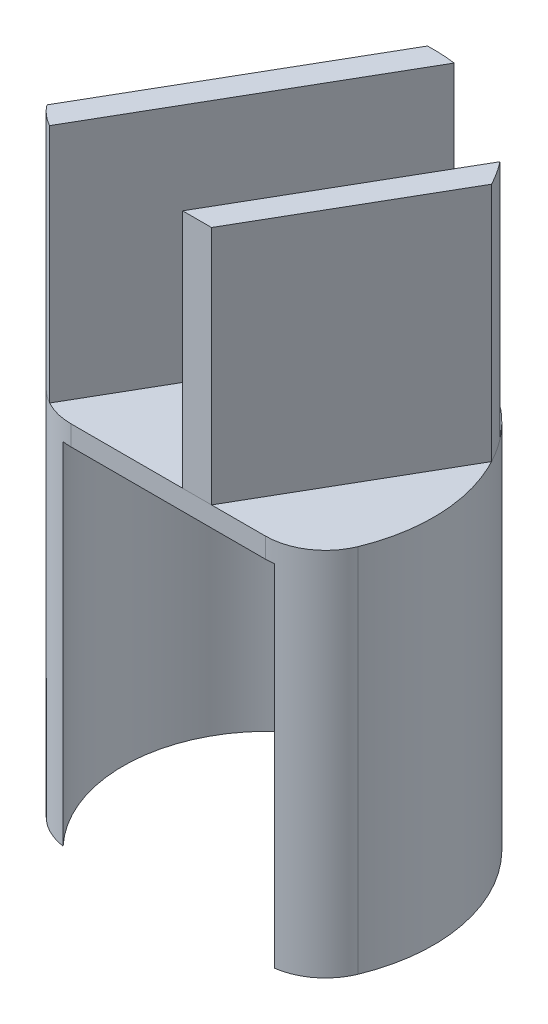
ISO-10303-21;
HEADER;
FILE_DESCRIPTION(('STEP AP214'),'2;1');
FILE_NAME('part.step','',(''),(''),'','','');
FILE_SCHEMA(('AUTOMOTIVE_DESIGN { 1 0 10303 214 1 1 1 1 }'));
ENDSEC;
DATA;
#1=APPLICATION_CONTEXT('core data for automotive mechanical design processes');
#2=APPLICATION_PROTOCOL_DEFINITION('international standard','automotive_design',2000,#1);
#3=PRODUCT_CONTEXT('',#1,'mechanical');
#4=PRODUCT('Part','Part','',(#3));
#5=PRODUCT_RELATED_PRODUCT_CATEGORY('part','',(#4));
#6=PRODUCT_DEFINITION_FORMATION('','',#4);
#7=PRODUCT_DEFINITION_CONTEXT('part definition',#1,'design');
#8=PRODUCT_DEFINITION('design','',#6,#7);
#9=PRODUCT_DEFINITION_SHAPE('','',#8);
#10=(LENGTH_UNIT() NAMED_UNIT(*) SI_UNIT(.MILLI.,.METRE.));
#11=(NAMED_UNIT(*) PLANE_ANGLE_UNIT() SI_UNIT($,.RADIAN.));
#12=(NAMED_UNIT(*) SI_UNIT($,.STERADIAN.) SOLID_ANGLE_UNIT());
#13=UNCERTAINTY_MEASURE_WITH_UNIT(LENGTH_MEASURE(1.E-05),#10,'distance_accuracy_value','');
#14=(GEOMETRIC_REPRESENTATION_CONTEXT(3) GLOBAL_UNCERTAINTY_ASSIGNED_CONTEXT((#13)) GLOBAL_UNIT_ASSIGNED_CONTEXT((#10,
#11,#12)) REPRESENTATION_CONTEXT('',''));
#15=CARTESIAN_POINT('',(0.,0.,0.));
#16=DIRECTION('',(0.,0.,1.));
#17=DIRECTION('',(1.,0.,0.));
#18=AXIS2_PLACEMENT_3D('',#15,#16,#17);
#19=CARTESIAN_POINT('',(0.,61.,0.));
#20=DIRECTION('',(0.,-1.,0.));
#21=DIRECTION('',(0.,0.,-1.));
#22=AXIS2_PLACEMENT_3D('',#19,#20,#21);
#23=CYLINDRICAL_SURFACE('',#22,16.5);
#24=CARTESIAN_POINT('',(0.,37.,0.));
#25=DIRECTION('',(0.,1.,0.));
#26=DIRECTION('',(0.,0.,1.));
#27=AXIS2_PLACEMENT_3D('',#24,#25,#26);
#28=CIRCLE('',#27,16.5);
#29=CARTESIAN_POINT('',(2.22258025338506,37.,-16.3496219227621));
#30=VERTEX_POINT('',#29);
#31=CARTESIAN_POINT('',(-0.583304866344873,37.,-16.4896863351884));
#32=VERTEX_POINT('',#31);
#33=EDGE_CURVE('E111',#30,#32,#28,.T.);
#34=ORIENTED_EDGE('',*,*,#33,.T.);
#35=DIRECTION('',(0.,-1.,0.));
#36=VECTOR('',#35,1.);
#37=CARTESIAN_POINT('',(-0.583304866344873,61.,-16.4896863351884));
#38=LINE('',#37,#36);
#39=CARTESIAN_POINT('',(-0.583304866344873,61.,-16.4896863351884));
#40=VERTEX_POINT('',#39);
#41=EDGE_CURVE('E12',#40,#32,#38,.T.);
#42=ORIENTED_EDGE('',*,*,#41,.F.);
#43=CARTESIAN_POINT('',(0.,61.,0.));
#44=DIRECTION('',(0.,1.,0.));
#45=DIRECTION('',(0.,0.,1.));
#46=AXIS2_PLACEMENT_3D('',#43,#44,#45);
#47=CIRCLE('',#46,16.5);
#48=CARTESIAN_POINT('',(2.22258025338506,61.,-16.3496219227621));
#49=VERTEX_POINT('',#48);
#50=EDGE_CURVE('E99',#49,#40,#47,.T.);
#51=ORIENTED_EDGE('',*,*,#50,.F.);
#52=DIRECTION('',(0.,-1.,0.));
#53=VECTOR('',#52,1.);
#54=CARTESIAN_POINT('',(2.22258025338506,61.,-16.3496219227621));
#55=LINE('',#54,#53);
#56=EDGE_CURVE('E107',#49,#30,#55,.T.);
#57=ORIENTED_EDGE('',*,*,#56,.T.);
#58=EDGE_LOOP('',(#34,#42,#51,#57));
#59=FACE_BOUND('',#58,.T.);
#60=ADVANCED_FACE('F48',(#59),#23,.T.);
#61=CARTESIAN_POINT('',(-0.583304866344873,61.,-16.4896863351884));
#62=DIRECTION('',(0.866025403784436,0.,0.500000000000004));
#63=DIRECTION('',(0.500000000000004,0.,-0.866025403784436));
#64=AXIS2_PLACEMENT_3D('',#61,#62,#63);
#65=PLANE('',#64);
#66=DIRECTION('',(-0.500000000000004,0.,0.866025403784436));
#67=VECTOR('',#66,1.);
#68=CARTESIAN_POINT('',(-0.583304866344873,37.,-16.4896863351884));
#69=LINE('',#68,#67);
#70=CARTESIAN_POINT('',(-14.4987670892268,37.,7.61260124564826));
#71=VERTEX_POINT('',#70);
#72=EDGE_CURVE('E103',#32,#71,#69,.T.);
#73=ORIENTED_EDGE('',*,*,#72,.T.);
#74=DIRECTION('',(0.,-1.,0.));
#75=VECTOR('',#74,1.);
#76=CARTESIAN_POINT('',(-14.4987670892268,61.,7.61260124564826));
#77=LINE('',#76,#75);
#78=CARTESIAN_POINT('',(-14.4987670892268,61.,7.61260124564826));
#79=VERTEX_POINT('',#78);
#80=EDGE_CURVE('E56',#79,#71,#77,.T.);
#81=ORIENTED_EDGE('',*,*,#80,.F.);
#82=DIRECTION('',(-0.500000000000004,0.,0.866025403784436));
#83=VECTOR('',#82,1.);
#84=CARTESIAN_POINT('',(-0.583304866344873,61.,-16.4896863351884));
#85=LINE('',#84,#83);
#86=EDGE_CURVE('E94',#40,#79,#85,.T.);
#87=ORIENTED_EDGE('',*,*,#86,.F.);
#88=ORIENTED_EDGE('',*,*,#41,.T.);
#89=EDGE_LOOP('',(#73,#81,#87,#88));
#90=FACE_BOUND('',#89,.T.);
#91=ADVANCED_FACE('F102',(#90),#65,.F.);
#92=CARTESIAN_POINT('',(-9.7082439194738,61.,4.));
#93=DIRECTION('',(0.,-1.,0.));
#94=DIRECTION('',(0.,0.,-1.));
#95=AXIS2_PLACEMENT_3D('',#92,#93,#94);
#96=CYLINDRICAL_SURFACE('',#95,6.);
#97=CARTESIAN_POINT('',(-9.7082439194738,37.,4.));
#98=DIRECTION('',(0.,1.,0.));
#99=DIRECTION('',(0.,0.,1.));
#100=AXIS2_PLACEMENT_3D('',#97,#98,#99);
#101=CIRCLE('',#100,6.);
#102=CARTESIAN_POINT('',(-12.5707356616124,37.,9.27315285443048));
#103=VERTEX_POINT('',#102);
#104=EDGE_CURVE('E81',#71,#103,#101,.T.);
#105=ORIENTED_EDGE('',*,*,#104,.T.);
#106=DIRECTION('',(0.,-1.,0.));
#107=VECTOR('',#106,1.);
#108=CARTESIAN_POINT('',(-12.5707356616124,61.,9.27315285443048));
#109=LINE('',#108,#107);
#110=CARTESIAN_POINT('',(-12.5707356616124,61.,9.27315285443048));
#111=VERTEX_POINT('',#110);
#112=EDGE_CURVE('E104',#111,#103,#109,.T.);
#113=ORIENTED_EDGE('',*,*,#112,.F.);
#114=CARTESIAN_POINT('',(-9.7082439194738,61.,4.));
#115=DIRECTION('',(0.,1.,0.));
#116=DIRECTION('',(0.,0.,1.));
#117=AXIS2_PLACEMENT_3D('',#114,#115,#116);
#118=CIRCLE('',#117,6.);
#119=EDGE_CURVE('E97',#79,#111,#118,.T.);
#120=ORIENTED_EDGE('',*,*,#119,.F.);
#121=ORIENTED_EDGE('',*,*,#80,.T.);
#122=EDGE_LOOP('',(#105,#113,#120,#121));
#123=FACE_BOUND('',#122,.T.);
#124=ADVANCED_FACE('F105',(#123),#96,.T.);
#125=CARTESIAN_POINT('',(2.22258025338506,61.,-16.3496219227621));
#126=DIRECTION('',(-0.866025403784436,0.,-0.500000000000004));
#127=DIRECTION('',(-0.500000000000004,0.,0.866025403784436));
#128=AXIS2_PLACEMENT_3D('',#125,#126,#127);
#129=PLANE('',#128);
#130=DIRECTION('',(0.500000000000004,0.,-0.866025403784436));
#131=VECTOR('',#130,1.);
#132=CARTESIAN_POINT('',(2.22258025338506,37.,-16.3496219227621));
#133=LINE('',#132,#131);
#134=EDGE_CURVE('E87',#103,#30,#133,.T.);
#135=ORIENTED_EDGE('',*,*,#134,.T.);
#136=ORIENTED_EDGE('',*,*,#56,.F.);
#137=DIRECTION('',(0.500000000000004,0.,-0.866025403784436));
#138=VECTOR('',#137,1.);
#139=CARTESIAN_POINT('',(2.22258025338506,61.,-16.3496219227621));
#140=LINE('',#139,#138);
#141=EDGE_CURVE('E64',#111,#49,#140,.T.);
#142=ORIENTED_EDGE('',*,*,#141,.F.);
#143=ORIENTED_EDGE('',*,*,#112,.T.);
#144=EDGE_LOOP('',(#135,#136,#142,#143));
#145=FACE_BOUND('',#144,.T.);
#146=ADVANCED_FACE('F118',(#145),#129,.F.);
#147=CARTESIAN_POINT('',(0.,61.,0.));
#148=DIRECTION('',(0.,1.,0.));
#149=DIRECTION('',(0.,0.,1.));
#150=AXIS2_PLACEMENT_3D('',#147,#148,#149);
#151=PLANE('',#150);
#152=ORIENTED_EDGE('',*,*,#50,.T.);
#153=ORIENTED_EDGE('',*,*,#86,.T.);
#154=ORIENTED_EDGE('',*,*,#119,.T.);
#155=ORIENTED_EDGE('',*,*,#141,.T.);
#156=EDGE_LOOP('',(#152,#153,#154,#155));
#157=FACE_BOUND('',#156,.T.);
#158=ADVANCED_FACE('F95',(#157),#151,.T.);
#159=CARTESIAN_POINT('',(0.,37.,0.));
#160=DIRECTION('',(0.,1.,0.));
#161=DIRECTION('',(0.,0.,1.));
#162=AXIS2_PLACEMENT_3D('',#159,#160,#161);
#163=PLANE('',#162);
#164=ORIENTED_EDGE('',*,*,#33,.F.);
#165=ORIENTED_EDGE('',*,*,#134,.F.);
#166=ORIENTED_EDGE('',*,*,#104,.F.);
#167=ORIENTED_EDGE('',*,*,#72,.F.);
#168=EDGE_LOOP('',(#164,#165,#166,#167));
#169=FACE_BOUND('',#168,.T.);
#170=ADVANCED_FACE('F121',(#169),#163,.F.);
#171=CLOSED_SHELL('',(#60,#91,#124,#146,#158,#170));
#172=MANIFOLD_SOLID_BREP('B2',#171);
#173=CARTESIAN_POINT('',(0.,61.,0.));
#174=DIRECTION('',(0.,-1.,0.));
#175=DIRECTION('',(0.,0.,-1.));
#176=AXIS2_PLACEMENT_3D('',#173,#174,#175);
#177=CYLINDRICAL_SURFACE('',#176,16.5);
#178=CARTESIAN_POINT('',(0.,37.,0.));
#179=DIRECTION('',(0.,1.,0.));
#180=DIRECTION('',(0.,0.,1.));
#181=AXIS2_PLACEMENT_3D('',#178,#179,#180);
#182=CIRCLE('',#181,16.5);
#183=CARTESIAN_POINT('',(14.5721396998828,37.,-7.73968633518831));
#184=VERTEX_POINT('',#183);
#185=CARTESIAN_POINT('',(13.0478978006905,37.,-10.099621922762));
#186=VERTEX_POINT('',#185);
#187=EDGE_CURVE('E244',#184,#186,#182,.T.);
#188=ORIENTED_EDGE('',*,*,#187,.T.);
#189=DIRECTION('',(0.,-1.,0.));
#190=VECTOR('',#189,1.);
#191=CARTESIAN_POINT('',(13.0478978006905,61.,-10.099621922762));
#192=LINE('',#191,#190);
#193=CARTESIAN_POINT('',(13.0478978006905,61.,-10.099621922762));
#194=VERTEX_POINT('',#193);
#195=EDGE_CURVE('E46',#194,#186,#192,.T.);
#196=ORIENTED_EDGE('',*,*,#195,.F.);
#197=CARTESIAN_POINT('',(0.,61.,0.));
#198=DIRECTION('',(0.,1.,0.));
#199=DIRECTION('',(0.,0.,1.));
#200=AXIS2_PLACEMENT_3D('',#197,#198,#199);
#201=CIRCLE('',#200,16.5);
#202=CARTESIAN_POINT('',(14.5721396998828,61.,-7.73968633518831));
#203=VERTEX_POINT('',#202);
#204=EDGE_CURVE('E232',#203,#194,#201,.T.);
#205=ORIENTED_EDGE('',*,*,#204,.F.);
#206=DIRECTION('',(0.,-1.,0.));
#207=VECTOR('',#206,1.);
#208=CARTESIAN_POINT('',(14.5721396998828,61.,-7.73968633518831));
#209=LINE('',#208,#207);
#210=EDGE_CURVE('E240',#203,#184,#209,.T.);
#211=ORIENTED_EDGE('',*,*,#210,.T.);
#212=EDGE_LOOP('',(#188,#196,#205,#211));
#213=FACE_BOUND('',#212,.T.);
#214=ADVANCED_FACE('F181',(#213),#177,.T.);
#215=CARTESIAN_POINT('',(13.0478978006905,61.,-10.099621922762));
#216=DIRECTION('',(0.866025403784436,0.,0.500000000000004));
#217=DIRECTION('',(0.500000000000004,0.,-0.866025403784436));
#218=AXIS2_PLACEMENT_3D('',#215,#216,#217);
#219=PLANE('',#218);
#220=DIRECTION('',(-0.500000000000004,0.,0.866025403784436));
#221=VECTOR('',#220,1.);
#222=CARTESIAN_POINT('',(13.0478978006905,37.,-10.099621922762));
#223=LINE('',#222,#221);
#224=CARTESIAN_POINT('',(1.44337567297402,37.,10.));
#225=VERTEX_POINT('',#224);
#226=EDGE_CURVE('E236',#186,#225,#223,.T.);
#227=ORIENTED_EDGE('',*,*,#226,.T.);
#228=DIRECTION('',(0.,-1.,0.));
#229=VECTOR('',#228,1.);
#230=CARTESIAN_POINT('',(1.44337567297402,61.,10.));
#231=LINE('',#230,#229);
#232=CARTESIAN_POINT('',(1.44337567297402,61.,10.));
#233=VERTEX_POINT('',#232);
#234=EDGE_CURVE('E189',#233,#225,#231,.T.);
#235=ORIENTED_EDGE('',*,*,#234,.F.);
#236=DIRECTION('',(-0.500000000000004,0.,0.866025403784436));
#237=VECTOR('',#236,1.);
#238=CARTESIAN_POINT('',(13.0478978006905,61.,-10.099621922762));
#239=LINE('',#238,#237);
#240=EDGE_CURVE('E227',#194,#233,#239,.T.);
#241=ORIENTED_EDGE('',*,*,#240,.F.);
#242=ORIENTED_EDGE('',*,*,#195,.T.);
#243=EDGE_LOOP('',(#227,#235,#241,#242));
#244=FACE_BOUND('',#243,.T.);
#245=ADVANCED_FACE('F235',(#244),#219,.F.);
#246=CARTESIAN_POINT('',(1.44337567297402,61.,10.));
#247=DIRECTION('',(0.,0.,-1.));
#248=DIRECTION('',(-1.,0.,0.));
#249=AXIS2_PLACEMENT_3D('',#246,#247,#248);
#250=PLANE('',#249);
#251=DIRECTION('',(1.,0.,0.));
#252=VECTOR('',#251,1.);
#253=CARTESIAN_POINT('',(1.44337567297402,37.,10.));
#254=LINE('',#253,#252);
#255=CARTESIAN_POINT('',(4.33012701892216,37.,10.));
#256=VERTEX_POINT('',#255);
#257=EDGE_CURVE('E214',#225,#256,#254,.T.);
#258=ORIENTED_EDGE('',*,*,#257,.T.);
#259=DIRECTION('',(0.,-1.,0.));
#260=VECTOR('',#259,1.);
#261=CARTESIAN_POINT('',(4.33012701892216,61.,10.));
#262=LINE('',#261,#260);
#263=CARTESIAN_POINT('',(4.33012701892216,61.,10.));
#264=VERTEX_POINT('',#263);
#265=EDGE_CURVE('E237',#264,#256,#262,.T.);
#266=ORIENTED_EDGE('',*,*,#265,.F.);
#267=DIRECTION('',(1.,0.,0.));
#268=VECTOR('',#267,1.);
#269=CARTESIAN_POINT('',(1.44337567297402,61.,10.));
#270=LINE('',#269,#268);
#271=EDGE_CURVE('E230',#233,#264,#270,.T.);
#272=ORIENTED_EDGE('',*,*,#271,.F.);
#273=ORIENTED_EDGE('',*,*,#234,.T.);
#274=EDGE_LOOP('',(#258,#266,#272,#273));
#275=FACE_BOUND('',#274,.T.);
#276=ADVANCED_FACE('F238',(#275),#250,.F.);
#277=CARTESIAN_POINT('',(14.5721396998828,61.,-7.73968633518831));
#278=DIRECTION('',(-0.866025403784436,0.,-0.500000000000004));
#279=DIRECTION('',(-0.500000000000004,0.,0.866025403784436));
#280=AXIS2_PLACEMENT_3D('',#277,#278,#279);
#281=PLANE('',#280);
#282=DIRECTION('',(0.500000000000004,0.,-0.866025403784436));
#283=VECTOR('',#282,1.);
#284=CARTESIAN_POINT('',(14.5721396998828,37.,-7.73968633518831));
#285=LINE('',#284,#283);
#286=EDGE_CURVE('E220',#256,#184,#285,.T.);
#287=ORIENTED_EDGE('',*,*,#286,.T.);
#288=ORIENTED_EDGE('',*,*,#210,.F.);
#289=DIRECTION('',(0.500000000000004,0.,-0.866025403784436));
#290=VECTOR('',#289,1.);
#291=CARTESIAN_POINT('',(14.5721396998828,61.,-7.73968633518831));
#292=LINE('',#291,#290);
#293=EDGE_CURVE('E197',#264,#203,#292,.T.);
#294=ORIENTED_EDGE('',*,*,#293,.F.);
#295=ORIENTED_EDGE('',*,*,#265,.T.);
#296=EDGE_LOOP('',(#287,#288,#294,#295));
#297=FACE_BOUND('',#296,.T.);
#298=ADVANCED_FACE('F251',(#297),#281,.F.);
#299=CARTESIAN_POINT('',(0.,61.,0.));
#300=DIRECTION('',(0.,1.,0.));
#301=DIRECTION('',(0.,0.,1.));
#302=AXIS2_PLACEMENT_3D('',#299,#300,#301);
#303=PLANE('',#302);
#304=ORIENTED_EDGE('',*,*,#204,.T.);
#305=ORIENTED_EDGE('',*,*,#240,.T.);
#306=ORIENTED_EDGE('',*,*,#271,.T.);
#307=ORIENTED_EDGE('',*,*,#293,.T.);
#308=EDGE_LOOP('',(#304,#305,#306,#307));
#309=FACE_BOUND('',#308,.T.);
#310=ADVANCED_FACE('F228',(#309),#303,.T.);
#311=CARTESIAN_POINT('',(0.,37.,0.));
#312=DIRECTION('',(0.,1.,0.));
#313=DIRECTION('',(0.,0.,1.));
#314=AXIS2_PLACEMENT_3D('',#311,#312,#313);
#315=PLANE('',#314);
#316=ORIENTED_EDGE('',*,*,#187,.F.);
#317=ORIENTED_EDGE('',*,*,#286,.F.);
#318=ORIENTED_EDGE('',*,*,#257,.F.);
#319=ORIENTED_EDGE('',*,*,#226,.F.);
#320=EDGE_LOOP('',(#316,#317,#318,#319));
#321=FACE_BOUND('',#320,.T.);
#322=ADVANCED_FACE('F254',(#321),#315,.F.);
#323=CLOSED_SHELL('',(#214,#245,#276,#298,#310,#322));
#324=MANIFOLD_SOLID_BREP('B6',#323);
#325=CARTESIAN_POINT('',(0.,0.,0.));
#326=DIRECTION('',(0.,1.,0.));
#327=DIRECTION('',(0.,0.,1.));
#328=AXIS2_PLACEMENT_3D('',#325,#326,#327);
#329=PLANE('',#328);
#330=CARTESIAN_POINT('',(0.,0.,0.));
#331=DIRECTION('',(0.,1.,0.));
#332=DIRECTION('',(0.,0.,1.));
#333=AXIS2_PLACEMENT_3D('',#330,#331,#332);
#334=CIRCLE('',#333,14.5);
#335=CARTESIAN_POINT('',(10.5571544737025,0.,9.93964231843291));
#336=VERTEX_POINT('',#335);
#337=CARTESIAN_POINT('',(-10.5571544737025,0.,9.93964231843291));
#338=VERTEX_POINT('',#337);
#339=EDGE_CURVE('E394',#336,#338,#334,.T.);
#340=ORIENTED_EDGE('',*,*,#339,.T.);
#341=CARTESIAN_POINT('',(-9.7082439194738,0.,4.));
#342=DIRECTION('',(0.,1.,0.));
#343=DIRECTION('',(0.,0.,1.));
#344=AXIS2_PLACEMENT_3D('',#341,#342,#343);
#345=CIRCLE('',#344,6.);
#346=CARTESIAN_POINT('',(-15.2558118734588,0.,6.28571428571428));
#347=VERTEX_POINT('',#346);
#348=EDGE_CURVE('E406',#338,#347,#345,.F.);
#349=ORIENTED_EDGE('',*,*,#348,.T.);
#350=CARTESIAN_POINT('',(0.,0.,0.));
#351=DIRECTION('',(0.,1.,0.));
#352=DIRECTION('',(0.,0.,1.));
#353=AXIS2_PLACEMENT_3D('',#350,#351,#352);
#354=CIRCLE('',#353,16.5);
#355=CARTESIAN_POINT('',(15.2558118734588,0.,6.28571428571428));
#356=VERTEX_POINT('',#355);
#357=EDGE_CURVE('E397',#356,#347,#354,.T.);
#358=ORIENTED_EDGE('',*,*,#357,.F.);
#359=CARTESIAN_POINT('',(9.7082439194738,0.,4.));
#360=DIRECTION('',(0.,1.,0.));
#361=DIRECTION('',(0.,0.,1.));
#362=AXIS2_PLACEMENT_3D('',#359,#360,#361);
#363=CIRCLE('',#362,6.);
#364=EDGE_CURVE('E404',#356,#336,#363,.F.);
#365=ORIENTED_EDGE('',*,*,#364,.T.);
#366=EDGE_LOOP('',(#340,#349,#358,#365));
#367=FACE_BOUND('',#366,.T.);
#368=ADVANCED_FACE('F305',(#367),#329,.F.);
#369=CARTESIAN_POINT('',(0.,35.,0.));
#370=DIRECTION('',(0.,-1.,0.));
#371=DIRECTION('',(0.,0.,-1.));
#372=AXIS2_PLACEMENT_3D('',#369,#370,#371);
#373=CYLINDRICAL_SURFACE('',#372,16.5);
#374=ORIENTED_EDGE('',*,*,#357,.T.);
#375=DIRECTION('',(0.,-1.,0.));
#376=VECTOR('',#375,1.);
#377=CARTESIAN_POINT('',(-15.2558118734588,35.,6.28571428571429));
#378=LINE('',#377,#376);
#379=CARTESIAN_POINT('',(-15.2558118734588,37.,6.28571428571428));
#380=VERTEX_POINT('',#379);
#381=EDGE_CURVE('E320',#347,#380,#378,.F.);
#382=ORIENTED_EDGE('',*,*,#381,.T.);
#383=CARTESIAN_POINT('',(0.,37.,0.));
#384=DIRECTION('',(0.,1.,0.));
#385=DIRECTION('',(0.,0.,1.));
#386=AXIS2_PLACEMENT_3D('',#383,#384,#385);
#387=CIRCLE('',#386,16.5);
#388=CARTESIAN_POINT('',(15.2558118734588,37.,6.28571428571428));
#389=VERTEX_POINT('',#388);
#390=EDGE_CURVE('E383',#389,#380,#387,.T.);
#391=ORIENTED_EDGE('',*,*,#390,.F.);
#392=DIRECTION('',(0.,-1.,0.));
#393=VECTOR('',#392,1.);
#394=CARTESIAN_POINT('',(15.2558118734588,35.,6.28571428571429));
#395=LINE('',#394,#393);
#396=EDGE_CURVE('E408',#389,#356,#395,.T.);
#397=ORIENTED_EDGE('',*,*,#396,.T.);
#398=EDGE_LOOP('',(#374,#382,#391,#397));
#399=FACE_BOUND('',#398,.T.);
#400=ADVANCED_FACE('F412',(#399),#373,.T.);
#401=CARTESIAN_POINT('',(0.,35.,0.));
#402=DIRECTION('',(0.,-1.,0.));
#403=DIRECTION('',(0.,0.,-1.));
#404=AXIS2_PLACEMENT_3D('',#401,#402,#403);
#405=CYLINDRICAL_SURFACE('',#404,14.5);
#406=CARTESIAN_POINT('',(0.,35.,0.));
#407=DIRECTION('',(0.,1.,0.));
#408=DIRECTION('',(0.,0.,1.));
#409=AXIS2_PLACEMENT_3D('',#406,#407,#408);
#410=CIRCLE('',#409,14.5);
#411=CARTESIAN_POINT('',(10.5571544737025,35.,9.93964231843291));
#412=VERTEX_POINT('',#411);
#413=CARTESIAN_POINT('',(-10.5571544737025,35.,9.93964231843291));
#414=VERTEX_POINT('',#413);
#415=EDGE_CURVE('E386',#412,#414,#410,.T.);
#416=ORIENTED_EDGE('',*,*,#415,.T.);
#417=DIRECTION('',(0.,-1.,0.));
#418=VECTOR('',#417,1.);
#419=CARTESIAN_POINT('',(-10.5571544737025,35.,9.93964231843291));
#420=LINE('',#419,#418);
#421=EDGE_CURVE('E363',#414,#338,#420,.T.);
#422=ORIENTED_EDGE('',*,*,#421,.T.);
#423=ORIENTED_EDGE('',*,*,#339,.F.);
#424=DIRECTION('',(0.,-1.,0.));
#425=VECTOR('',#424,1.);
#426=CARTESIAN_POINT('',(10.5571544737025,0.,9.93964231843291));
#427=LINE('',#426,#425);
#428=EDGE_CURVE('E368',#336,#412,#427,.F.);
#429=ORIENTED_EDGE('',*,*,#428,.T.);
#430=EDGE_LOOP('',(#416,#422,#423,#429));
#431=FACE_BOUND('',#430,.T.);
#432=ADVANCED_FACE('F419',(#431),#405,.F.);
#433=CARTESIAN_POINT('',(0.,35.,0.));
#434=DIRECTION('',(0.,1.,0.));
#435=DIRECTION('',(0.,0.,1.));
#436=AXIS2_PLACEMENT_3D('',#433,#434,#435);
#437=PLANE('',#436);
#438=CARTESIAN_POINT('',(0.,35.,0.));
#439=DIRECTION('',(0.,1.,0.));
#440=DIRECTION('',(0.,0.,1.));
#441=AXIS2_PLACEMENT_3D('',#438,#439,#440);
#442=CIRCLE('',#441,3.75);
#443=CARTESIAN_POINT('',(0.,35.,3.75));
#444=VERTEX_POINT('',#443);
#445=EDGE_CURVE('E384',#444,#444,#442,.F.);
#446=ORIENTED_EDGE('',*,*,#445,.F.);
#447=EDGE_LOOP('',(#446));
#448=FACE_BOUND('',#447,.T.);
#449=DIRECTION('',(1.,0.,0.));
#450=VECTOR('',#449,1.);
#451=CARTESIAN_POINT('',(0.,35.,10.));
#452=LINE('',#451,#450);
#453=CARTESIAN_POINT('',(-9.7082439194738,35.,10.));
#454=VERTEX_POINT('',#453);
#455=CARTESIAN_POINT('',(9.7082439194738,35.,10.));
#456=VERTEX_POINT('',#455);
#457=EDGE_CURVE('E376',#454,#456,#452,.T.);
#458=ORIENTED_EDGE('',*,*,#457,.F.);
#459=CARTESIAN_POINT('',(-9.7082439194738,35.,4.));
#460=DIRECTION('',(0.,1.,0.));
#461=DIRECTION('',(0.,0.,1.));
#462=AXIS2_PLACEMENT_3D('',#459,#460,#461);
#463=CIRCLE('',#462,6.);
#464=EDGE_CURVE('E357',#454,#414,#463,.F.);
#465=ORIENTED_EDGE('',*,*,#464,.T.);
#466=ORIENTED_EDGE('',*,*,#415,.F.);
#467=CARTESIAN_POINT('',(9.7082439194738,35.,4.));
#468=DIRECTION('',(0.,1.,0.));
#469=DIRECTION('',(0.,0.,1.));
#470=AXIS2_PLACEMENT_3D('',#467,#468,#469);
#471=CIRCLE('',#470,6.);
#472=EDGE_CURVE('E369',#412,#456,#471,.F.);
#473=ORIENTED_EDGE('',*,*,#472,.T.);
#474=EDGE_LOOP('',(#458,#465,#466,#473));
#475=FACE_BOUND('',#474,.T.);
#476=ADVANCED_FACE('F381',(#448,#475),#437,.F.);
#477=CARTESIAN_POINT('',(0.,37.,0.));
#478=DIRECTION('',(0.,1.,0.));
#479=DIRECTION('',(0.,0.,1.));
#480=AXIS2_PLACEMENT_3D('',#477,#478,#479);
#481=PLANE('',#480);
#482=CARTESIAN_POINT('',(0.,37.,0.));
#483=DIRECTION('',(0.,1.,0.));
#484=DIRECTION('',(0.,0.,1.));
#485=AXIS2_PLACEMENT_3D('',#482,#483,#484);
#486=CIRCLE('',#485,3.75);
#487=CARTESIAN_POINT('',(0.,37.,3.75));
#488=VERTEX_POINT('',#487);
#489=EDGE_CURVE('E389',#488,#488,#486,.T.);
#490=ORIENTED_EDGE('',*,*,#489,.F.);
#491=EDGE_LOOP('',(#490));
#492=FACE_BOUND('',#491,.T.);
#493=ORIENTED_EDGE('',*,*,#390,.T.);
#494=CARTESIAN_POINT('',(-9.7082439194738,37.,4.));
#495=DIRECTION('',(0.,1.,0.));
#496=DIRECTION('',(0.,0.,1.));
#497=AXIS2_PLACEMENT_3D('',#494,#495,#496);
#498=CIRCLE('',#497,6.);
#499=CARTESIAN_POINT('',(-9.7082439194738,37.,10.));
#500=VERTEX_POINT('',#499);
#501=EDGE_CURVE('E179',#380,#500,#498,.T.);
#502=ORIENTED_EDGE('',*,*,#501,.T.);
#503=DIRECTION('',(1.,0.,0.));
#504=VECTOR('',#503,1.);
#505=CARTESIAN_POINT('',(0.,37.,10.));
#506=LINE('',#505,#504);
#507=CARTESIAN_POINT('',(9.7082439194738,37.,10.));
#508=VERTEX_POINT('',#507);
#509=EDGE_CURVE('E378',#500,#508,#506,.T.);
#510=ORIENTED_EDGE('',*,*,#509,.T.);
#511=CARTESIAN_POINT('',(9.7082439194738,37.,4.));
#512=DIRECTION('',(0.,1.,0.));
#513=DIRECTION('',(0.,0.,1.));
#514=AXIS2_PLACEMENT_3D('',#511,#512,#513);
#515=CIRCLE('',#514,6.);
#516=EDGE_CURVE('E313',#508,#389,#515,.T.);
#517=ORIENTED_EDGE('',*,*,#516,.T.);
#518=EDGE_LOOP('',(#493,#502,#510,#517));
#519=FACE_BOUND('',#518,.T.);
#520=ADVANCED_FACE('F420',(#492,#519),#481,.T.);
#521=CARTESIAN_POINT('',(0.,0.,10.));
#522=DIRECTION('',(0.,0.,1.));
#523=DIRECTION('',(1.,0.,0.));
#524=AXIS2_PLACEMENT_3D('',#521,#522,#523);
#525=PLANE('',#524);
#526=ORIENTED_EDGE('',*,*,#509,.F.);
#527=DIRECTION('',(0.,1.,0.));
#528=VECTOR('',#527,1.);
#529=CARTESIAN_POINT('',(-9.7082439194738,0.,10.));
#530=LINE('',#529,#528);
#531=EDGE_CURVE('E361',#500,#454,#530,.F.);
#532=ORIENTED_EDGE('',*,*,#531,.T.);
#533=ORIENTED_EDGE('',*,*,#457,.T.);
#534=DIRECTION('',(0.,1.,0.));
#535=VECTOR('',#534,1.);
#536=CARTESIAN_POINT('',(9.7082439194738,37.,10.));
#537=LINE('',#536,#535);
#538=EDGE_CURVE('E379',#456,#508,#537,.T.);
#539=ORIENTED_EDGE('',*,*,#538,.T.);
#540=EDGE_LOOP('',(#526,#532,#533,#539));
#541=FACE_BOUND('',#540,.T.);
#542=ADVANCED_FACE('F374',(#541),#525,.T.);
#543=CARTESIAN_POINT('',(0.,-0.001000000000001,0.));
#544=DIRECTION('',(0.,1.,0.));
#545=DIRECTION('',(0.,0.,1.));
#546=AXIS2_PLACEMENT_3D('',#543,#544,#545);
#547=CYLINDRICAL_SURFACE('',#546,3.75);
#548=ORIENTED_EDGE('',*,*,#489,.T.);
#549=EDGE_LOOP('',(#548));
#550=FACE_BOUND('',#549,.T.);
#551=ORIENTED_EDGE('',*,*,#445,.T.);
#552=EDGE_LOOP('',(#551));
#553=FACE_BOUND('',#552,.T.);
#554=ADVANCED_FACE('F428',(#550,#553),#547,.F.);
#555=CARTESIAN_POINT('',(-9.7082439194738,35.,4.));
#556=DIRECTION('',(0.,-1.,0.));
#557=DIRECTION('',(0.,0.,-1.));
#558=AXIS2_PLACEMENT_3D('',#555,#556,#557);
#559=CYLINDRICAL_SURFACE('',#558,6.);
#560=ORIENTED_EDGE('',*,*,#501,.F.);
#561=ORIENTED_EDGE('',*,*,#381,.F.);
#562=ORIENTED_EDGE('',*,*,#348,.F.);
#563=ORIENTED_EDGE('',*,*,#421,.F.);
#564=ORIENTED_EDGE('',*,*,#464,.F.);
#565=ORIENTED_EDGE('',*,*,#531,.F.);
#566=EDGE_LOOP('',(#560,#561,#562,#563,#564,#565));
#567=FACE_BOUND('',#566,.T.);
#568=ADVANCED_FACE('F360',(#567),#559,.T.);
#569=CARTESIAN_POINT('',(9.7082439194738,35.,4.));
#570=DIRECTION('',(0.,-1.,0.));
#571=DIRECTION('',(0.,0.,-1.));
#572=AXIS2_PLACEMENT_3D('',#569,#570,#571);
#573=CYLINDRICAL_SURFACE('',#572,6.);
#574=ORIENTED_EDGE('',*,*,#364,.F.);
#575=ORIENTED_EDGE('',*,*,#396,.F.);
#576=ORIENTED_EDGE('',*,*,#516,.F.);
#577=ORIENTED_EDGE('',*,*,#538,.F.);
#578=ORIENTED_EDGE('',*,*,#472,.F.);
#579=ORIENTED_EDGE('',*,*,#428,.F.);
#580=EDGE_LOOP('',(#574,#575,#576,#577,#578,#579));
#581=FACE_BOUND('',#580,.T.);
#582=ADVANCED_FACE('F307',(#581),#573,.T.);
#583=CLOSED_SHELL('',(#368,#400,#432,#476,#520,#542,#554,#568,#582));
#584=MANIFOLD_SOLID_BREP('B40',#583);
#585=ADVANCED_BREP_SHAPE_REPRESENTATION('',(#18,#172,#324,#584),#14);
#586=SHAPE_DEFINITION_REPRESENTATION(#9,#585);
ENDSEC;
END-ISO-10303-21;
